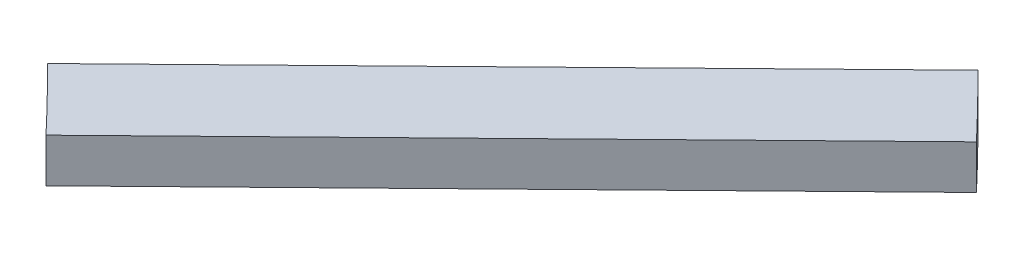
ISO-10303-21;
HEADER;
FILE_DESCRIPTION(('STEP AP214'),'2;1');
FILE_NAME('part.step','',(''),(''),'','','');
FILE_SCHEMA(('AUTOMOTIVE_DESIGN { 1 0 10303 214 1 1 1 1 }'));
ENDSEC;
DATA;
#1=APPLICATION_CONTEXT('core data for automotive mechanical design processes');
#2=APPLICATION_PROTOCOL_DEFINITION('international standard','automotive_design',2000,#1);
#3=PRODUCT_CONTEXT('',#1,'mechanical');
#4=PRODUCT('Part','Part','',(#3));
#5=PRODUCT_RELATED_PRODUCT_CATEGORY('part','',(#4));
#6=PRODUCT_DEFINITION_FORMATION('','',#4);
#7=PRODUCT_DEFINITION_CONTEXT('part definition',#1,'design');
#8=PRODUCT_DEFINITION('design','',#6,#7);
#9=PRODUCT_DEFINITION_SHAPE('','',#8);
#10=(LENGTH_UNIT() NAMED_UNIT(*) SI_UNIT(.MILLI.,.METRE.));
#11=(NAMED_UNIT(*) PLANE_ANGLE_UNIT() SI_UNIT($,.RADIAN.));
#12=(NAMED_UNIT(*) SI_UNIT($,.STERADIAN.) SOLID_ANGLE_UNIT());
#13=UNCERTAINTY_MEASURE_WITH_UNIT(LENGTH_MEASURE(1.E-05),#10,'distance_accuracy_value','');
#14=(GEOMETRIC_REPRESENTATION_CONTEXT(3) GLOBAL_UNCERTAINTY_ASSIGNED_CONTEXT((#13)) GLOBAL_UNIT_ASSIGNED_CONTEXT((#10,
#11,#12)) REPRESENTATION_CONTEXT('',''));
#15=CARTESIAN_POINT('',(0.,0.,0.));
#16=DIRECTION('',(0.,0.,1.));
#17=DIRECTION('',(1.,0.,0.));
#18=AXIS2_PLACEMENT_3D('',#15,#16,#17);
#19=CARTESIAN_POINT('',(0.,7.874,0.));
#20=DIRECTION('',(0.,1.,0.));
#21=DIRECTION('',(0.,0.,1.));
#22=AXIS2_PLACEMENT_3D('',#19,#20,#21);
#23=PLANE('',#22);
#24=CARTESIAN_POINT('',(0.,7.874,0.));
#25=DIRECTION('',(0.,1.,0.));
#26=DIRECTION('',(0.,0.,1.));
#27=AXIS2_PLACEMENT_3D('',#24,#25,#26);
#28=CIRCLE('',#27,17.9970288837074);
#29=CARTESIAN_POINT('',(12.7048410225891,7.874,-12.7467667756076));
#30=VERTEX_POINT('',#29);
#31=CARTESIAN_POINT('',(13.0595453261769,7.874,-12.3831064161837));
#32=VERTEX_POINT('',#31);
#33=EDGE_CURVE('E78',#30,#32,#28,.F.);
#34=ORIENTED_EDGE('',*,*,#33,.T.);
#35=DIRECTION('',(-0.71586684925972,0.,0.698236818086071));
#36=VECTOR('',#35,1.);
#37=CARTESIAN_POINT('',(13.0595453261769,7.874,-12.3831064161837));
#38=LINE('',#37,#36);
#39=CARTESIAN_POINT('',(15.787222230092,7.874,-15.0436073796326));
#40=VERTEX_POINT('',#39);
#41=EDGE_CURVE('E59',#32,#40,#38,.F.);
#42=ORIENTED_EDGE('',*,*,#41,.T.);
#43=CARTESIAN_POINT('',(0.,7.874,0.));
#44=DIRECTION('',(0.,1.,0.));
#45=DIRECTION('',(0.,0.,1.));
#46=AXIS2_PLACEMENT_3D('',#43,#44,#45);
#47=CIRCLE('',#46,21.8070288837074);
#48=CARTESIAN_POINT('',(15.4325179265043,7.874,-15.4072677390565));
#49=VERTEX_POINT('',#48);
#50=EDGE_CURVE('E20',#40,#49,#47,.T.);
#51=ORIENTED_EDGE('',*,*,#50,.T.);
#52=DIRECTION('',(0.71586684925972,0.,-0.698236818086072));
#53=VECTOR('',#52,1.);
#54=CARTESIAN_POINT('',(12.7048410225891,7.874,-12.7467667756076));
#55=LINE('',#54,#53);
#56=EDGE_CURVE('E56',#49,#30,#55,.F.);
#57=ORIENTED_EDGE('',*,*,#56,.T.);
#58=EDGE_LOOP('',(#34,#42,#51,#57));
#59=FACE_BOUND('',#58,.T.);
#60=ADVANCED_FACE('F17',(#59),#23,.T.);
#61=CARTESIAN_POINT('',(12.7048410225891,7.874,-12.7467667756076));
#62=DIRECTION('',(0.698236818086072,0.,0.71586684925972));
#63=DIRECTION('',(0.71586684925972,0.,-0.698236818086072));
#64=AXIS2_PLACEMENT_3D('',#61,#62,#63);
#65=PLANE('',#64);
#66=DIRECTION('',(0.,1.,0.));
#67=VECTOR('',#66,1.);
#68=CARTESIAN_POINT('',(12.7048410225891,7.874,-12.7467667756076));
#69=LINE('',#68,#67);
#70=CARTESIAN_POINT('',(12.7048410225891,7.62,-12.7467667756076));
#71=VERTEX_POINT('',#70);
#72=EDGE_CURVE('E66',#71,#30,#69,.T.);
#73=ORIENTED_EDGE('',*,*,#72,.T.);
#74=ORIENTED_EDGE('',*,*,#56,.F.);
#75=DIRECTION('',(0.,1.,0.));
#76=VECTOR('',#75,1.);
#77=CARTESIAN_POINT('',(15.4325179265043,7.874,-15.4072677390565));
#78=LINE('',#77,#76);
#79=CARTESIAN_POINT('',(15.4325179265043,7.62,-15.4072677390565));
#80=VERTEX_POINT('',#79);
#81=EDGE_CURVE('E65',#80,#49,#78,.T.);
#82=ORIENTED_EDGE('',*,*,#81,.F.);
#83=DIRECTION('',(-0.71586684925972,0.,0.698236818086071));
#84=VECTOR('',#83,1.);
#85=CARTESIAN_POINT('',(15.4325179265043,7.62,-15.4072677390565));
#86=LINE('',#85,#84);
#87=EDGE_CURVE('E70',#80,#71,#86,.T.);
#88=ORIENTED_EDGE('',*,*,#87,.T.);
#89=EDGE_LOOP('',(#73,#74,#82,#88));
#90=FACE_BOUND('',#89,.T.);
#91=ADVANCED_FACE('F63',(#90),#65,.F.);
#92=CARTESIAN_POINT('',(0.,7.874,0.));
#93=DIRECTION('',(0.,1.,0.));
#94=DIRECTION('',(0.,0.,1.));
#95=AXIS2_PLACEMENT_3D('',#92,#93,#94);
#96=CYLINDRICAL_SURFACE('',#95,17.9970288837074);
#97=DIRECTION('',(0.,1.,0.));
#98=VECTOR('',#97,1.);
#99=CARTESIAN_POINT('',(13.0595453261769,7.874,-12.3831064161837));
#100=LINE('',#99,#98);
#101=CARTESIAN_POINT('',(13.0595453261769,7.62,-12.3831064161837));
#102=VERTEX_POINT('',#101);
#103=EDGE_CURVE('E72',#102,#32,#100,.T.);
#104=ORIENTED_EDGE('',*,*,#103,.T.);
#105=ORIENTED_EDGE('',*,*,#33,.F.);
#106=ORIENTED_EDGE('',*,*,#72,.F.);
#107=CARTESIAN_POINT('',(0.,7.62,0.));
#108=DIRECTION('',(0.,1.,0.));
#109=DIRECTION('',(0.,0.,1.));
#110=AXIS2_PLACEMENT_3D('',#107,#108,#109);
#111=CIRCLE('',#110,17.9970288837074);
#112=EDGE_CURVE('E80',#71,#102,#111,.F.);
#113=ORIENTED_EDGE('',*,*,#112,.T.);
#114=EDGE_LOOP('',(#104,#105,#106,#113));
#115=FACE_BOUND('',#114,.T.);
#116=ADVANCED_FACE('F87',(#115),#96,.F.);
#117=CARTESIAN_POINT('',(13.0595453261769,7.874,-12.3831064161837));
#118=DIRECTION('',(-0.698236818086071,0.,-0.71586684925972));
#119=DIRECTION('',(-0.71586684925972,0.,0.698236818086071));
#120=AXIS2_PLACEMENT_3D('',#117,#118,#119);
#121=PLANE('',#120);
#122=DIRECTION('',(0.,1.,0.));
#123=VECTOR('',#122,1.);
#124=CARTESIAN_POINT('',(15.787222230092,7.874,-15.0436073796326));
#125=LINE('',#124,#123);
#126=CARTESIAN_POINT('',(15.787222230092,7.62,-15.0436073796326));
#127=VERTEX_POINT('',#126);
#128=EDGE_CURVE('E34',#40,#127,#125,.F.);
#129=ORIENTED_EDGE('',*,*,#128,.F.);
#130=ORIENTED_EDGE('',*,*,#41,.F.);
#131=ORIENTED_EDGE('',*,*,#103,.F.);
#132=DIRECTION('',(0.715866849259708,0.,-0.698236818086084));
#133=VECTOR('',#132,1.);
#134=CARTESIAN_POINT('',(13.0595453261769,7.62,-12.3831064161837));
#135=LINE('',#134,#133);
#136=EDGE_CURVE('E26',#102,#127,#135,.T.);
#137=ORIENTED_EDGE('',*,*,#136,.T.);
#138=EDGE_LOOP('',(#129,#130,#131,#137));
#139=FACE_BOUND('',#138,.T.);
#140=ADVANCED_FACE('F84',(#139),#121,.F.);
#141=CARTESIAN_POINT('',(0.,7.874,0.));
#142=DIRECTION('',(0.,1.,0.));
#143=DIRECTION('',(0.,0.,1.));
#144=AXIS2_PLACEMENT_3D('',#141,#142,#143);
#145=CYLINDRICAL_SURFACE('',#144,21.8070288837074);
#146=ORIENTED_EDGE('',*,*,#50,.F.);
#147=ORIENTED_EDGE('',*,*,#128,.T.);
#148=CARTESIAN_POINT('',(0.,7.62,0.));
#149=DIRECTION('',(0.,1.,0.));
#150=DIRECTION('',(0.,0.,1.));
#151=AXIS2_PLACEMENT_3D('',#148,#149,#150);
#152=CIRCLE('',#151,21.8070288837074);
#153=EDGE_CURVE('E11',#127,#80,#152,.T.);
#154=ORIENTED_EDGE('',*,*,#153,.T.);
#155=ORIENTED_EDGE('',*,*,#81,.T.);
#156=EDGE_LOOP('',(#146,#147,#154,#155));
#157=FACE_BOUND('',#156,.T.);
#158=ADVANCED_FACE('F68',(#157),#145,.T.);
#159=CARTESIAN_POINT('',(0.,7.62,0.));
#160=DIRECTION('',(0.,1.,0.));
#161=DIRECTION('',(0.,0.,1.));
#162=AXIS2_PLACEMENT_3D('',#159,#160,#161);
#163=PLANE('',#162);
#164=ORIENTED_EDGE('',*,*,#136,.F.);
#165=ORIENTED_EDGE('',*,*,#112,.F.);
#166=ORIENTED_EDGE('',*,*,#87,.F.);
#167=ORIENTED_EDGE('',*,*,#153,.F.);
#168=EDGE_LOOP('',(#164,#165,#166,#167));
#169=FACE_BOUND('',#168,.T.);
#170=ADVANCED_FACE('F90',(#169),#163,.F.);
#171=CLOSED_SHELL('',(#60,#91,#116,#140,#158,#170));
#172=MANIFOLD_SOLID_BREP('B1',#171);
#173=ADVANCED_BREP_SHAPE_REPRESENTATION('',(#18,#172),#14);
#174=SHAPE_DEFINITION_REPRESENTATION(#9,#173);
ENDSEC;
END-ISO-10303-21;
